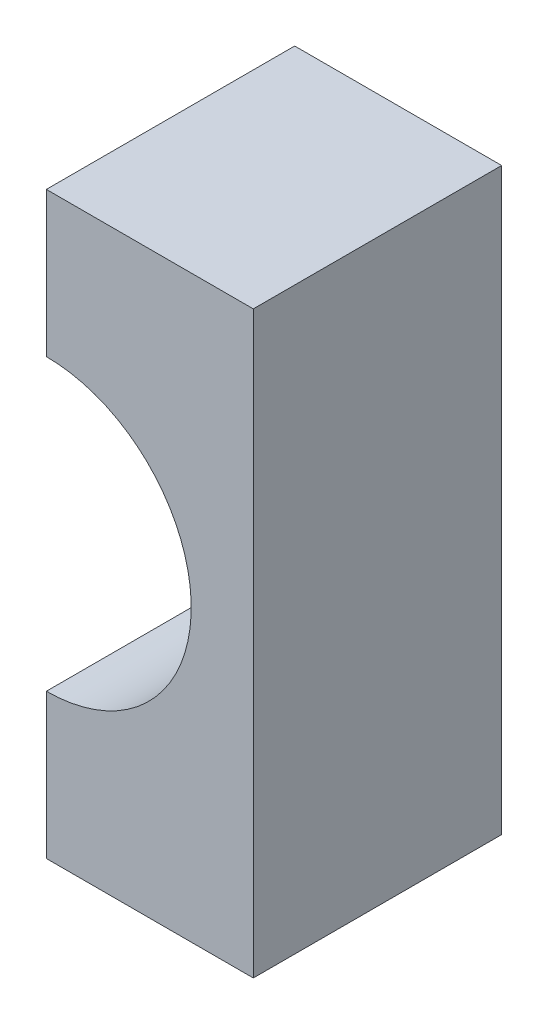
ISO-10303-21;
HEADER;
FILE_DESCRIPTION(('STEP AP214'),'2;1');
FILE_NAME('part.step','',(''),(''),'','','');
FILE_SCHEMA(('AUTOMOTIVE_DESIGN { 1 0 10303 214 1 1 1 1 }'));
ENDSEC;
DATA;
#1=APPLICATION_CONTEXT('core data for automotive mechanical design processes');
#2=APPLICATION_PROTOCOL_DEFINITION('international standard','automotive_design',2000,#1);
#3=PRODUCT_CONTEXT('',#1,'mechanical');
#4=PRODUCT('Part','Part','',(#3));
#5=PRODUCT_RELATED_PRODUCT_CATEGORY('part','',(#4));
#6=PRODUCT_DEFINITION_FORMATION('','',#4);
#7=PRODUCT_DEFINITION_CONTEXT('part definition',#1,'design');
#8=PRODUCT_DEFINITION('design','',#6,#7);
#9=PRODUCT_DEFINITION_SHAPE('','',#8);
#10=(LENGTH_UNIT() NAMED_UNIT(*) SI_UNIT(.MILLI.,.METRE.));
#11=(NAMED_UNIT(*) PLANE_ANGLE_UNIT() SI_UNIT($,.RADIAN.));
#12=(NAMED_UNIT(*) SI_UNIT($,.STERADIAN.) SOLID_ANGLE_UNIT());
#13=UNCERTAINTY_MEASURE_WITH_UNIT(LENGTH_MEASURE(1.E-05),#10,'distance_accuracy_value','');
#14=(GEOMETRIC_REPRESENTATION_CONTEXT(3) GLOBAL_UNCERTAINTY_ASSIGNED_CONTEXT((#13)) GLOBAL_UNIT_ASSIGNED_CONTEXT((#10,
#11,#12)) REPRESENTATION_CONTEXT('',''));
#15=CARTESIAN_POINT('',(0.,0.,0.));
#16=DIRECTION('',(0.,0.,1.));
#17=DIRECTION('',(1.,0.,0.));
#18=AXIS2_PLACEMENT_3D('',#15,#16,#17);
#19=CARTESIAN_POINT('',(-0.8,-0.35,0.));
#20=DIRECTION('',(0.,-1.,0.));
#21=DIRECTION('',(0.,0.,-1.));
#22=AXIS2_PLACEMENT_3D('',#19,#20,#21);
#23=PLANE('',#22);
#24=DIRECTION('',(-1.,0.,0.));
#25=VECTOR('',#24,1.);
#26=CARTESIAN_POINT('',(0.8,-0.35,0.));
#27=LINE('',#26,#25);
#28=CARTESIAN_POINT('',(-0.55,-0.35,0.));
#29=VERTEX_POINT('',#28);
#30=CARTESIAN_POINT('',(-0.8,-0.35,0.));
#31=VERTEX_POINT('',#30);
#32=EDGE_CURVE('E105',#29,#31,#27,.T.);
#33=ORIENTED_EDGE('',*,*,#32,.F.);
#34=DIRECTION('',(0.,0.,1.));
#35=VECTOR('',#34,1.);
#36=CARTESIAN_POINT('',(-0.55,-0.35,0.));
#37=LINE('',#36,#35);
#38=CARTESIAN_POINT('',(-0.55,-0.35,0.3));
#39=VERTEX_POINT('',#38);
#40=EDGE_CURVE('E93',#29,#39,#37,.T.);
#41=ORIENTED_EDGE('',*,*,#40,.T.);
#42=DIRECTION('',(1.,0.,0.));
#43=VECTOR('',#42,1.);
#44=CARTESIAN_POINT('',(0.8,-0.35,0.3));
#45=LINE('',#44,#43);
#46=CARTESIAN_POINT('',(-0.8,-0.35,0.3));
#47=VERTEX_POINT('',#46);
#48=EDGE_CURVE('E148',#47,#39,#45,.T.);
#49=ORIENTED_EDGE('',*,*,#48,.F.);
#50=DIRECTION('',(0.,0.,1.));
#51=VECTOR('',#50,1.);
#52=CARTESIAN_POINT('',(-0.8,-0.35,0.));
#53=LINE('',#52,#51);
#54=EDGE_CURVE('E11',#31,#47,#53,.T.);
#55=ORIENTED_EDGE('',*,*,#54,.F.);
#56=EDGE_LOOP('',(#33,#41,#49,#55));
#57=FACE_BOUND('',#56,.T.);
#58=ADVANCED_FACE('F17',(#57),#23,.T.);
#59=CARTESIAN_POINT('',(-0.8,-0.175,0.));
#60=DIRECTION('',(-1.,0.,0.));
#61=DIRECTION('',(0.,0.,1.));
#62=AXIS2_PLACEMENT_3D('',#59,#60,#61);
#63=PLANE('',#62);
#64=DIRECTION('',(0.,1.,0.));
#65=VECTOR('',#64,1.);
#66=CARTESIAN_POINT('',(-0.8,-0.35,0.));
#67=LINE('',#66,#65);
#68=CARTESIAN_POINT('',(-0.8,-0.175,0.));
#69=VERTEX_POINT('',#68);
#70=EDGE_CURVE('E109',#31,#69,#67,.T.);
#71=ORIENTED_EDGE('',*,*,#70,.F.);
#72=ORIENTED_EDGE('',*,*,#54,.T.);
#73=DIRECTION('',(0.,-1.,0.));
#74=VECTOR('',#73,1.);
#75=CARTESIAN_POINT('',(-0.8,-0.35,0.3));
#76=LINE('',#75,#74);
#77=CARTESIAN_POINT('',(-0.8,-0.175,0.3));
#78=VERTEX_POINT('',#77);
#79=EDGE_CURVE('E145',#78,#47,#76,.T.);
#80=ORIENTED_EDGE('',*,*,#79,.F.);
#81=DIRECTION('',(0.,0.,1.));
#82=VECTOR('',#81,1.);
#83=CARTESIAN_POINT('',(-0.8,-0.175,0.));
#84=LINE('',#83,#82);
#85=EDGE_CURVE('E28',#69,#78,#84,.T.);
#86=ORIENTED_EDGE('',*,*,#85,.F.);
#87=EDGE_LOOP('',(#71,#72,#80,#86));
#88=FACE_BOUND('',#87,.T.);
#89=ADVANCED_FACE('F202',(#88),#63,.T.);
#90=CARTESIAN_POINT('',(-0.8,0.,0.));
#91=DIRECTION('',(0.,0.,1.));
#92=DIRECTION('',(0.,-1.,0.));
#93=AXIS2_PLACEMENT_3D('',#90,#91,#92);
#94=CYLINDRICAL_SURFACE('',#93,0.175);
#95=CARTESIAN_POINT('',(-0.8,0.,0.));
#96=DIRECTION('',(0.,0.,1.));
#97=DIRECTION('',(0.,-1.,0.));
#98=AXIS2_PLACEMENT_3D('',#95,#96,#97);
#99=CIRCLE('',#98,0.175);
#100=CARTESIAN_POINT('',(-0.8,0.175,0.));
#101=VERTEX_POINT('',#100);
#102=EDGE_CURVE('E126',#69,#101,#99,.T.);
#103=ORIENTED_EDGE('',*,*,#102,.F.);
#104=ORIENTED_EDGE('',*,*,#85,.T.);
#105=CARTESIAN_POINT('',(-0.8,0.,0.3));
#106=DIRECTION('',(0.,0.,-1.));
#107=DIRECTION('',(0.,-1.,0.));
#108=AXIS2_PLACEMENT_3D('',#105,#106,#107);
#109=CIRCLE('',#108,0.175);
#110=CARTESIAN_POINT('',(-0.8,0.175,0.3));
#111=VERTEX_POINT('',#110);
#112=EDGE_CURVE('E132',#111,#78,#109,.T.);
#113=ORIENTED_EDGE('',*,*,#112,.F.);
#114=DIRECTION('',(0.,0.,1.));
#115=VECTOR('',#114,1.);
#116=CARTESIAN_POINT('',(-0.8,0.175,0.));
#117=LINE('',#116,#115);
#118=EDGE_CURVE('E72',#101,#111,#117,.T.);
#119=ORIENTED_EDGE('',*,*,#118,.F.);
#120=EDGE_LOOP('',(#103,#104,#113,#119));
#121=FACE_BOUND('',#120,.T.);
#122=ADVANCED_FACE('F19',(#121),#94,.F.);
#123=CARTESIAN_POINT('',(-0.8,0.35,0.));
#124=DIRECTION('',(-1.,0.,0.));
#125=DIRECTION('',(0.,1.,0.));
#126=AXIS2_PLACEMENT_3D('',#123,#124,#125);
#127=PLANE('',#126);
#128=DIRECTION('',(0.,1.,0.));
#129=VECTOR('',#128,1.);
#130=CARTESIAN_POINT('',(-0.8,0.175,0.));
#131=LINE('',#130,#129);
#132=CARTESIAN_POINT('',(-0.8,0.35,0.));
#133=VERTEX_POINT('',#132);
#134=EDGE_CURVE('E123',#101,#133,#131,.T.);
#135=ORIENTED_EDGE('',*,*,#134,.F.);
#136=ORIENTED_EDGE('',*,*,#118,.T.);
#137=DIRECTION('',(0.,-1.,0.));
#138=VECTOR('',#137,1.);
#139=CARTESIAN_POINT('',(-0.8,0.175,0.3));
#140=LINE('',#139,#138);
#141=CARTESIAN_POINT('',(-0.8,0.35,0.3));
#142=VERTEX_POINT('',#141);
#143=EDGE_CURVE('E129',#142,#111,#140,.T.);
#144=ORIENTED_EDGE('',*,*,#143,.F.);
#145=DIRECTION('',(0.,0.,1.));
#146=VECTOR('',#145,1.);
#147=CARTESIAN_POINT('',(-0.8,0.35,0.));
#148=LINE('',#147,#146);
#149=EDGE_CURVE('E83',#133,#142,#148,.T.);
#150=ORIENTED_EDGE('',*,*,#149,.F.);
#151=EDGE_LOOP('',(#135,#136,#144,#150));
#152=FACE_BOUND('',#151,.T.);
#153=ADVANCED_FACE('F189',(#152),#127,.T.);
#154=CARTESIAN_POINT('',(-0.55,0.35,0.));
#155=DIRECTION('',(0.,1.,0.));
#156=DIRECTION('',(1.,0.,0.));
#157=AXIS2_PLACEMENT_3D('',#154,#155,#156);
#158=PLANE('',#157);
#159=DIRECTION('',(1.,0.,0.));
#160=VECTOR('',#159,1.);
#161=CARTESIAN_POINT('',(-0.8,0.35,0.));
#162=LINE('',#161,#160);
#163=CARTESIAN_POINT('',(-0.55,0.35,0.));
#164=VERTEX_POINT('',#163);
#165=EDGE_CURVE('E114',#133,#164,#162,.T.);
#166=ORIENTED_EDGE('',*,*,#165,.F.);
#167=ORIENTED_EDGE('',*,*,#149,.T.);
#168=DIRECTION('',(-1.,0.,0.));
#169=VECTOR('',#168,1.);
#170=CARTESIAN_POINT('',(-0.8,0.35,0.3));
#171=LINE('',#170,#169);
#172=CARTESIAN_POINT('',(-0.55,0.35,0.3));
#173=VERTEX_POINT('',#172);
#174=EDGE_CURVE('E133',#173,#142,#171,.T.);
#175=ORIENTED_EDGE('',*,*,#174,.F.);
#176=DIRECTION('',(0.,0.,1.));
#177=VECTOR('',#176,1.);
#178=CARTESIAN_POINT('',(-0.55,0.35,0.));
#179=LINE('',#178,#177);
#180=EDGE_CURVE('E21',#164,#173,#179,.T.);
#181=ORIENTED_EDGE('',*,*,#180,.F.);
#182=EDGE_LOOP('',(#166,#167,#175,#181));
#183=FACE_BOUND('',#182,.T.);
#184=ADVANCED_FACE('F194',(#183),#158,.T.);
#185=CARTESIAN_POINT('',(-0.55,-0.35,0.));
#186=DIRECTION('',(1.,0.,0.));
#187=DIRECTION('',(0.,1.,0.));
#188=AXIS2_PLACEMENT_3D('',#185,#186,#187);
#189=PLANE('',#188);
#190=DIRECTION('',(0.,1.,0.));
#191=VECTOR('',#190,1.);
#192=CARTESIAN_POINT('',(-0.55,-0.35,0.));
#193=LINE('',#192,#191);
#194=EDGE_CURVE('E97',#29,#164,#193,.T.);
#195=ORIENTED_EDGE('',*,*,#194,.T.);
#196=ORIENTED_EDGE('',*,*,#180,.T.);
#197=DIRECTION('',(0.,1.,0.));
#198=VECTOR('',#197,1.);
#199=CARTESIAN_POINT('',(-0.55,-0.35,0.3));
#200=LINE('',#199,#198);
#201=EDGE_CURVE('E99',#39,#173,#200,.T.);
#202=ORIENTED_EDGE('',*,*,#201,.F.);
#203=ORIENTED_EDGE('',*,*,#40,.F.);
#204=EDGE_LOOP('',(#195,#196,#202,#203));
#205=FACE_BOUND('',#204,.T.);
#206=ADVANCED_FACE('F95',(#205),#189,.T.);
#207=CARTESIAN_POINT('',(-0.675,0.,0.3));
#208=DIRECTION('',(0.,0.,1.));
#209=DIRECTION('',(1.,0.,0.));
#210=AXIS2_PLACEMENT_3D('',#207,#208,#209);
#211=PLANE('',#210);
#212=ORIENTED_EDGE('',*,*,#201,.T.);
#213=ORIENTED_EDGE('',*,*,#174,.T.);
#214=ORIENTED_EDGE('',*,*,#143,.T.);
#215=ORIENTED_EDGE('',*,*,#112,.T.);
#216=ORIENTED_EDGE('',*,*,#79,.T.);
#217=ORIENTED_EDGE('',*,*,#48,.T.);
#218=EDGE_LOOP('',(#212,#213,#214,#215,#216,#217));
#219=FACE_BOUND('',#218,.T.);
#220=ADVANCED_FACE('F222',(#219),#211,.T.);
#221=CARTESIAN_POINT('',(-0.675,0.,0.));
#222=DIRECTION('',(0.,0.,1.));
#223=DIRECTION('',(1.,0.,0.));
#224=AXIS2_PLACEMENT_3D('',#221,#222,#223);
#225=PLANE('',#224);
#226=ORIENTED_EDGE('',*,*,#194,.F.);
#227=ORIENTED_EDGE('',*,*,#32,.T.);
#228=ORIENTED_EDGE('',*,*,#70,.T.);
#229=ORIENTED_EDGE('',*,*,#102,.T.);
#230=ORIENTED_EDGE('',*,*,#134,.T.);
#231=ORIENTED_EDGE('',*,*,#165,.T.);
#232=EDGE_LOOP('',(#226,#227,#228,#229,#230,#231));
#233=FACE_BOUND('',#232,.T.);
#234=ADVANCED_FACE('F112',(#233),#225,.F.);
#235=CLOSED_SHELL('',(#58,#89,#122,#153,#184,#206,#220,#234));
#236=MANIFOLD_SOLID_BREP('B1',#235);
#237=ADVANCED_BREP_SHAPE_REPRESENTATION('',(#18,#236),#14);
#238=SHAPE_DEFINITION_REPRESENTATION(#9,#237);
ENDSEC;
END-ISO-10303-21;
